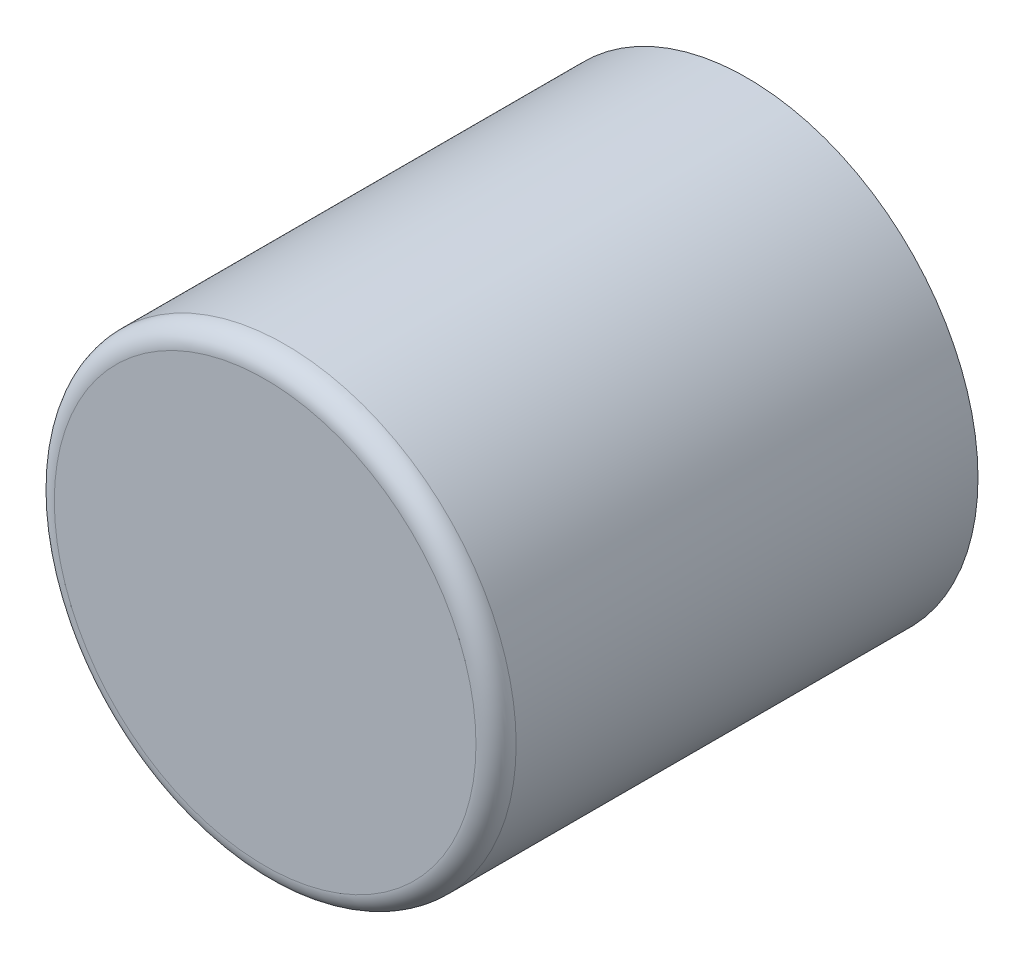
ISO-10303-21;
HEADER;
FILE_DESCRIPTION(('STEP AP214'),'2;1');
FILE_NAME('part.step','',(''),(''),'','','');
FILE_SCHEMA(('AUTOMOTIVE_DESIGN { 1 0 10303 214 1 1 1 1 }'));
ENDSEC;
DATA;
#1=APPLICATION_CONTEXT('core data for automotive mechanical design processes');
#2=APPLICATION_PROTOCOL_DEFINITION('international standard','automotive_design',2000,#1);
#3=PRODUCT_CONTEXT('',#1,'mechanical');
#4=PRODUCT('Part','Part','',(#3));
#5=PRODUCT_RELATED_PRODUCT_CATEGORY('part','',(#4));
#6=PRODUCT_DEFINITION_FORMATION('','',#4);
#7=PRODUCT_DEFINITION_CONTEXT('part definition',#1,'design');
#8=PRODUCT_DEFINITION('design','',#6,#7);
#9=PRODUCT_DEFINITION_SHAPE('','',#8);
#10=(LENGTH_UNIT() NAMED_UNIT(*) SI_UNIT(.MILLI.,.METRE.));
#11=(NAMED_UNIT(*) PLANE_ANGLE_UNIT() SI_UNIT($,.RADIAN.));
#12=(NAMED_UNIT(*) SI_UNIT($,.STERADIAN.) SOLID_ANGLE_UNIT());
#13=UNCERTAINTY_MEASURE_WITH_UNIT(LENGTH_MEASURE(1.E-05),#10,'distance_accuracy_value','');
#14=(GEOMETRIC_REPRESENTATION_CONTEXT(3) GLOBAL_UNCERTAINTY_ASSIGNED_CONTEXT((#13)) GLOBAL_UNIT_ASSIGNED_CONTEXT((#10,
#11,#12)) REPRESENTATION_CONTEXT('',''));
#15=CARTESIAN_POINT('',(0.,0.,0.));
#16=DIRECTION('',(0.,0.,1.));
#17=DIRECTION('',(1.,0.,0.));
#18=AXIS2_PLACEMENT_3D('',#15,#16,#17);
#19=CARTESIAN_POINT('',(0.,0.,48.));
#20=DIRECTION('',(0.,0.,-1.));
#21=DIRECTION('',(-1.,0.,0.));
#22=AXIS2_PLACEMENT_3D('',#19,#20,#21);
#23=CYLINDRICAL_SURFACE('',#22,23.);
#24=CARTESIAN_POINT('',(0.,0.,46.));
#25=DIRECTION('',(0.,0.,1.));
#26=DIRECTION('',(1.,0.,0.));
#27=AXIS2_PLACEMENT_3D('',#24,#25,#26);
#28=CIRCLE('',#27,23.);
#29=CARTESIAN_POINT('',(23.,0.,46.));
#30=VERTEX_POINT('',#29);
#31=EDGE_CURVE('E10',#30,#30,#28,.F.);
#32=ORIENTED_EDGE('',*,*,#31,.T.);
#33=EDGE_LOOP('',(#32));
#34=FACE_BOUND('',#33,.T.);
#35=CARTESIAN_POINT('',(0.,0.,0.));
#36=DIRECTION('',(0.,0.,1.));
#37=DIRECTION('',(1.,0.,0.));
#38=AXIS2_PLACEMENT_3D('',#35,#36,#37);
#39=CIRCLE('',#38,23.);
#40=CARTESIAN_POINT('',(23.,0.,0.));
#41=VERTEX_POINT('',#40);
#42=EDGE_CURVE('E54',#41,#41,#39,.T.);
#43=ORIENTED_EDGE('',*,*,#42,.T.);
#44=EDGE_LOOP('',(#43));
#45=FACE_BOUND('',#44,.T.);
#46=ADVANCED_FACE('F41',(#34,#45),#23,.T.);
#47=CARTESIAN_POINT('',(0.,0.,48.));
#48=DIRECTION('',(0.,0.,1.));
#49=DIRECTION('',(1.,0.,0.));
#50=AXIS2_PLACEMENT_3D('',#47,#48,#49);
#51=PLANE('',#50);
#52=CARTESIAN_POINT('',(0.,0.,48.));
#53=DIRECTION('',(0.,0.,1.));
#54=DIRECTION('',(1.,0.,0.));
#55=AXIS2_PLACEMENT_3D('',#52,#53,#54);
#56=CIRCLE('',#55,21.);
#57=CARTESIAN_POINT('',(21.,0.,48.));
#58=VERTEX_POINT('',#57);
#59=EDGE_CURVE('E49',#58,#58,#56,.T.);
#60=ORIENTED_EDGE('',*,*,#59,.T.);
#61=EDGE_LOOP('',(#60));
#62=FACE_BOUND('',#61,.T.);
#63=ADVANCED_FACE('F81',(#62),#51,.T.);
#64=CARTESIAN_POINT('',(0.,0.,0.));
#65=DIRECTION('',(0.,0.,1.));
#66=DIRECTION('',(1.,0.,0.));
#67=AXIS2_PLACEMENT_3D('',#64,#65,#66);
#68=PLANE('',#67);
#69=CARTESIAN_POINT('',(0.,0.,0.));
#70=DIRECTION('',(0.,0.,-1.));
#71=DIRECTION('',(-1.,0.,0.));
#72=AXIS2_PLACEMENT_3D('',#69,#70,#71);
#73=CIRCLE('',#72,19.);
#74=CARTESIAN_POINT('',(-19.,0.,0.));
#75=VERTEX_POINT('',#74);
#76=EDGE_CURVE('E62',#75,#75,#73,.T.);
#77=ORIENTED_EDGE('',*,*,#76,.F.);
#78=EDGE_LOOP('',(#77));
#79=FACE_BOUND('',#78,.T.);
#80=ORIENTED_EDGE('',*,*,#42,.F.);
#81=EDGE_LOOP('',(#80));
#82=FACE_BOUND('',#81,.T.);
#83=ADVANCED_FACE('F75',(#79,#82),#68,.F.);
#84=CARTESIAN_POINT('',(0.,0.,44.));
#85=DIRECTION('',(0.,0.,-1.));
#86=DIRECTION('',(-1.,0.,0.));
#87=AXIS2_PLACEMENT_3D('',#84,#85,#86);
#88=CYLINDRICAL_SURFACE('',#87,19.);
#89=CARTESIAN_POINT('',(0.,0.,44.));
#90=DIRECTION('',(0.,0.,-1.));
#91=DIRECTION('',(-1.,0.,0.));
#92=AXIS2_PLACEMENT_3D('',#89,#90,#91);
#93=CIRCLE('',#92,19.);
#94=CARTESIAN_POINT('',(-19.,0.,44.));
#95=VERTEX_POINT('',#94);
#96=EDGE_CURVE('E59',#95,#95,#93,.T.);
#97=ORIENTED_EDGE('',*,*,#96,.F.);
#98=EDGE_LOOP('',(#97));
#99=FACE_BOUND('',#98,.T.);
#100=ORIENTED_EDGE('',*,*,#76,.T.);
#101=EDGE_LOOP('',(#100));
#102=FACE_BOUND('',#101,.T.);
#103=ADVANCED_FACE('F72',(#99,#102),#88,.F.);
#104=CARTESIAN_POINT('',(0.,0.,44.));
#105=DIRECTION('',(0.,0.,-1.));
#106=DIRECTION('',(-1.,0.,0.));
#107=AXIS2_PLACEMENT_3D('',#104,#105,#106);
#108=PLANE('',#107);
#109=ORIENTED_EDGE('',*,*,#96,.T.);
#110=EDGE_LOOP('',(#109));
#111=FACE_BOUND('',#110,.T.);
#112=ADVANCED_FACE('F70',(#111),#108,.T.);
#113=CARTESIAN_POINT('',(0.,0.,46.));
#114=DIRECTION('',(0.,0.,1.));
#115=DIRECTION('',(1.,0.,0.));
#116=AXIS2_PLACEMENT_3D('',#113,#114,#115);
#117=TOROIDAL_SURFACE('',#116,21.,2.);
#118=ORIENTED_EDGE('',*,*,#31,.F.);
#119=EDGE_LOOP('',(#118));
#120=FACE_BOUND('',#119,.T.);
#121=ORIENTED_EDGE('',*,*,#59,.F.);
#122=EDGE_LOOP('',(#121));
#123=FACE_BOUND('',#122,.T.);
#124=ADVANCED_FACE('F43',(#120,#123),#117,.T.);
#125=CLOSED_SHELL('',(#46,#63,#83,#103,#112,#124));
#126=MANIFOLD_SOLID_BREP('B2',#125);
#127=ADVANCED_BREP_SHAPE_REPRESENTATION('',(#18,#126),#14);
#128=SHAPE_DEFINITION_REPRESENTATION(#9,#127);
ENDSEC;
END-ISO-10303-21;
